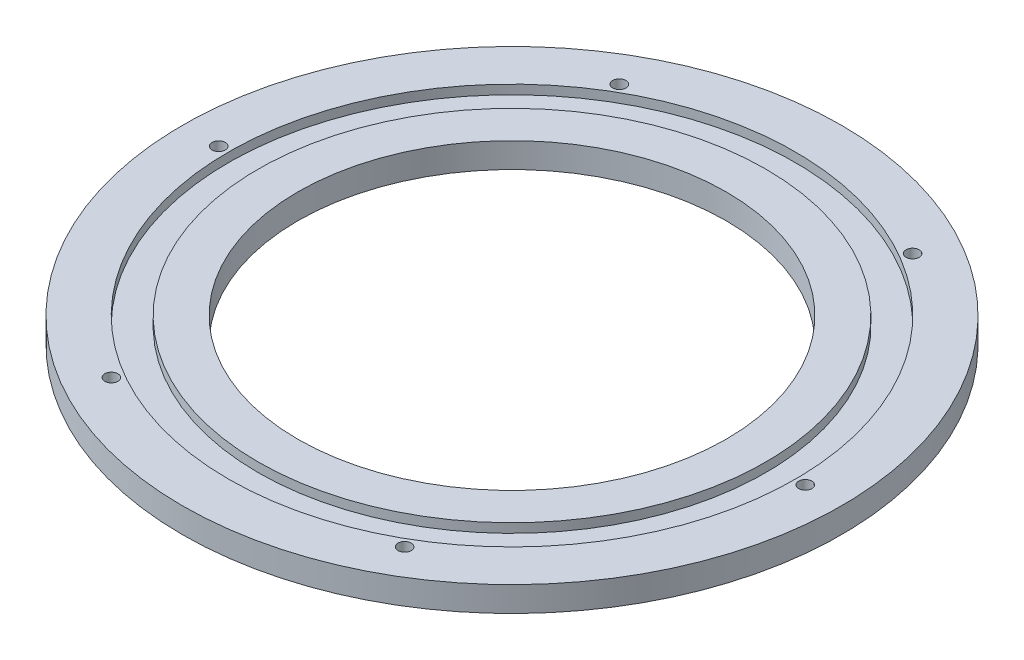
ISO-10303-21;
HEADER;
FILE_DESCRIPTION(('STEP AP214'),'2;1');
FILE_NAME('part.step','',(''),(''),'','','');
FILE_SCHEMA(('AUTOMOTIVE_DESIGN { 1 0 10303 214 1 1 1 1 }'));
ENDSEC;
DATA;
#1=APPLICATION_CONTEXT('core data for automotive mechanical design processes');
#2=APPLICATION_PROTOCOL_DEFINITION('international standard','automotive_design',2000,#1);
#3=PRODUCT_CONTEXT('',#1,'mechanical');
#4=PRODUCT('Part','Part','',(#3));
#5=PRODUCT_RELATED_PRODUCT_CATEGORY('part','',(#4));
#6=PRODUCT_DEFINITION_FORMATION('','',#4);
#7=PRODUCT_DEFINITION_CONTEXT('part definition',#1,'design');
#8=PRODUCT_DEFINITION('design','',#6,#7);
#9=PRODUCT_DEFINITION_SHAPE('','',#8);
#10=(LENGTH_UNIT() NAMED_UNIT(*) SI_UNIT(.MILLI.,.METRE.));
#11=(NAMED_UNIT(*) PLANE_ANGLE_UNIT() SI_UNIT($,.RADIAN.));
#12=(NAMED_UNIT(*) SI_UNIT($,.STERADIAN.) SOLID_ANGLE_UNIT());
#13=UNCERTAINTY_MEASURE_WITH_UNIT(LENGTH_MEASURE(1.E-05),#10,'distance_accuracy_value','');
#14=(GEOMETRIC_REPRESENTATION_CONTEXT(3) GLOBAL_UNCERTAINTY_ASSIGNED_CONTEXT((#13)) GLOBAL_UNIT_ASSIGNED_CONTEXT((#10,
#11,#12)) REPRESENTATION_CONTEXT('',''));
#15=CARTESIAN_POINT('',(0.,0.,0.));
#16=DIRECTION('',(0.,0.,1.));
#17=DIRECTION('',(1.,0.,0.));
#18=AXIS2_PLACEMENT_3D('',#15,#16,#17);
#19=CARTESIAN_POINT('',(0.,19.,0.));
#20=DIRECTION('',(0.,1.,0.));
#21=DIRECTION('',(0.,0.,1.));
#22=AXIS2_PLACEMENT_3D('',#19,#20,#21);
#23=PLANE('',#22);
#24=CARTESIAN_POINT('',(0.,19.,0.));
#25=DIRECTION('',(0.,1.,0.));
#26=DIRECTION('',(0.,0.,1.));
#27=AXIS2_PLACEMENT_3D('',#24,#25,#26);
#28=CIRCLE('',#27,162.5);
#29=CARTESIAN_POINT('',(0.,19.,162.5));
#30=VERTEX_POINT('',#29);
#31=EDGE_CURVE('E49',#30,#30,#28,.T.);
#32=ORIENTED_EDGE('',*,*,#31,.F.);
#33=EDGE_LOOP('',(#32));
#34=FACE_BOUND('',#33,.T.);
#35=CARTESIAN_POINT('',(0.,19.,0.));
#36=DIRECTION('',(0.,1.,0.));
#37=DIRECTION('',(0.,0.,1.));
#38=AXIS2_PLACEMENT_3D('',#35,#36,#37);
#39=CIRCLE('',#38,192.5);
#40=CARTESIAN_POINT('',(0.,19.,192.5));
#41=VERTEX_POINT('',#40);
#42=EDGE_CURVE('E67',#41,#41,#39,.T.);
#43=ORIENTED_EDGE('',*,*,#42,.T.);
#44=EDGE_LOOP('',(#43));
#45=FACE_BOUND('',#44,.T.);
#46=ADVANCED_FACE('F36',(#34,#45),#23,.T.);
#47=CARTESIAN_POINT('',(111.25,19.,-192.690652342037));
#48=DIRECTION('',(0.,-1.,0.));
#49=DIRECTION('',(0.,0.,1.));
#50=AXIS2_PLACEMENT_3D('',#47,#48,#49);
#51=CIRCLE('',#50,5.00000000000001);
#52=CARTESIAN_POINT('',(111.25,19.,-187.690652342037));
#53=VERTEX_POINT('',#52);
#54=EDGE_CURVE('E103',#53,#53,#51,.T.);
#55=ORIENTED_EDGE('',*,*,#54,.T.);
#56=EDGE_LOOP('',(#55));
#57=FACE_BOUND('',#56,.T.);
#58=CARTESIAN_POINT('',(-111.25,19.,192.690652342037));
#59=DIRECTION('',(0.,-1.,0.));
#60=DIRECTION('',(0.,0.,1.));
#61=AXIS2_PLACEMENT_3D('',#58,#59,#60);
#62=CIRCLE('',#61,5.00000000000001);
#63=CARTESIAN_POINT('',(-111.25,19.,197.690652342037));
#64=VERTEX_POINT('',#63);
#65=EDGE_CURVE('E88',#64,#64,#62,.T.);
#66=ORIENTED_EDGE('',*,*,#65,.T.);
#67=EDGE_LOOP('',(#66));
#68=FACE_BOUND('',#67,.T.);
#69=CARTESIAN_POINT('',(-222.5,19.,-1.55431223447522E-12));
#70=DIRECTION('',(0.,-1.,0.));
#71=DIRECTION('',(0.,0.,1.));
#72=AXIS2_PLACEMENT_3D('',#69,#70,#71);
#73=CIRCLE('',#72,4.99999999999992);
#74=CARTESIAN_POINT('',(-222.5,19.,4.99999999999837));
#75=VERTEX_POINT('',#74);
#76=EDGE_CURVE('E87',#75,#75,#73,.T.);
#77=ORIENTED_EDGE('',*,*,#76,.T.);
#78=EDGE_LOOP('',(#77));
#79=FACE_BOUND('',#78,.T.);
#80=CARTESIAN_POINT('',(222.5,19.,0.));
#81=DIRECTION('',(0.,-1.,0.));
#82=DIRECTION('',(0.,0.,-1.));
#83=AXIS2_PLACEMENT_3D('',#80,#81,#82);
#84=CIRCLE('',#83,4.99999999999999);
#85=CARTESIAN_POINT('',(222.5,19.,-4.99999999999999));
#86=VERTEX_POINT('',#85);
#87=EDGE_CURVE('E79',#86,#86,#84,.T.);
#88=ORIENTED_EDGE('',*,*,#87,.T.);
#89=EDGE_LOOP('',(#88));
#90=FACE_BOUND('',#89,.T.);
#91=CARTESIAN_POINT('',(-111.25,19.,-192.690652342037));
#92=DIRECTION('',(0.,-1.,0.));
#93=DIRECTION('',(0.,0.,-1.));
#94=AXIS2_PLACEMENT_3D('',#91,#92,#93);
#95=CIRCLE('',#94,5.00000000000001);
#96=CARTESIAN_POINT('',(-111.25,19.,-197.690652342037));
#97=VERTEX_POINT('',#96);
#98=EDGE_CURVE('E104',#97,#97,#95,.T.);
#99=ORIENTED_EDGE('',*,*,#98,.T.);
#100=EDGE_LOOP('',(#99));
#101=FACE_BOUND('',#100,.T.);
#102=CARTESIAN_POINT('',(111.25,19.,192.690652342037));
#103=DIRECTION('',(0.,-1.,0.));
#104=DIRECTION('',(0.,0.,-1.));
#105=AXIS2_PLACEMENT_3D('',#102,#103,#104);
#106=CIRCLE('',#105,5.00000000000001);
#107=CARTESIAN_POINT('',(111.25,19.,187.690652342037));
#108=VERTEX_POINT('',#107);
#109=EDGE_CURVE('E71',#108,#108,#106,.T.);
#110=ORIENTED_EDGE('',*,*,#109,.T.);
#111=EDGE_LOOP('',(#110));
#112=FACE_BOUND('',#111,.T.);
#113=CARTESIAN_POINT('',(0.,19.,0.));
#114=DIRECTION('',(0.,1.,0.));
#115=DIRECTION('',(0.,0.,1.));
#116=AXIS2_PLACEMENT_3D('',#113,#114,#115);
#117=CIRCLE('',#116,215.);
#118=CARTESIAN_POINT('',(0.,19.,215.));
#119=VERTEX_POINT('',#118);
#120=EDGE_CURVE('E59',#119,#119,#117,.T.);
#121=ORIENTED_EDGE('',*,*,#120,.F.);
#122=EDGE_LOOP('',(#121));
#123=FACE_BOUND('',#122,.T.);
#124=CARTESIAN_POINT('',(0.,19.,0.));
#125=DIRECTION('',(0.,1.,0.));
#126=DIRECTION('',(0.,0.,1.));
#127=AXIS2_PLACEMENT_3D('',#124,#125,#126);
#128=CIRCLE('',#127,250.);
#129=CARTESIAN_POINT('',(0.,19.,250.));
#130=VERTEX_POINT('',#129);
#131=EDGE_CURVE('E10',#130,#130,#128,.T.);
#132=ORIENTED_EDGE('',*,*,#131,.T.);
#133=EDGE_LOOP('',(#132));
#134=FACE_BOUND('',#133,.T.);
#135=ADVANCED_FACE('F123',(#57,#68,#79,#90,#101,#112,#123,#134),#23,.T.);
#136=CARTESIAN_POINT('',(0.,0.,0.));
#137=DIRECTION('',(0.,1.,0.));
#138=DIRECTION('',(0.,0.,1.));
#139=AXIS2_PLACEMENT_3D('',#136,#137,#138);
#140=PLANE('',#139);
#141=CARTESIAN_POINT('',(111.25,0.,-192.690652342037));
#142=DIRECTION('',(0.,-1.,0.));
#143=DIRECTION('',(0.,0.,1.));
#144=AXIS2_PLACEMENT_3D('',#141,#142,#143);
#145=CIRCLE('',#144,5.00000000000001);
#146=CARTESIAN_POINT('',(111.25,0.,-187.690652342037));
#147=VERTEX_POINT('',#146);
#148=EDGE_CURVE('E99',#147,#147,#145,.T.);
#149=ORIENTED_EDGE('',*,*,#148,.F.);
#150=EDGE_LOOP('',(#149));
#151=FACE_BOUND('',#150,.T.);
#152=CARTESIAN_POINT('',(-111.25,0.,192.690652342037));
#153=DIRECTION('',(0.,-1.,0.));
#154=DIRECTION('',(0.,0.,1.));
#155=AXIS2_PLACEMENT_3D('',#152,#153,#154);
#156=CIRCLE('',#155,5.00000000000001);
#157=CARTESIAN_POINT('',(-111.25,0.,197.690652342037));
#158=VERTEX_POINT('',#157);
#159=EDGE_CURVE('E108',#158,#158,#156,.T.);
#160=ORIENTED_EDGE('',*,*,#159,.F.);
#161=EDGE_LOOP('',(#160));
#162=FACE_BOUND('',#161,.T.);
#163=CARTESIAN_POINT('',(-222.5,0.,-1.55431223447522E-12));
#164=DIRECTION('',(0.,-1.,0.));
#165=DIRECTION('',(0.,0.,1.));
#166=AXIS2_PLACEMENT_3D('',#163,#164,#165);
#167=CIRCLE('',#166,4.99999999999992);
#168=CARTESIAN_POINT('',(-222.5,0.,4.99999999999837));
#169=VERTEX_POINT('',#168);
#170=EDGE_CURVE('E83',#169,#169,#167,.T.);
#171=ORIENTED_EDGE('',*,*,#170,.F.);
#172=EDGE_LOOP('',(#171));
#173=FACE_BOUND('',#172,.T.);
#174=CARTESIAN_POINT('',(222.5,0.,0.));
#175=DIRECTION('',(0.,-1.,0.));
#176=DIRECTION('',(0.,0.,-1.));
#177=AXIS2_PLACEMENT_3D('',#174,#175,#176);
#178=CIRCLE('',#177,4.99999999999999);
#179=CARTESIAN_POINT('',(222.5,0.,-4.99999999999999));
#180=VERTEX_POINT('',#179);
#181=EDGE_CURVE('E92',#180,#180,#178,.T.);
#182=ORIENTED_EDGE('',*,*,#181,.F.);
#183=EDGE_LOOP('',(#182));
#184=FACE_BOUND('',#183,.T.);
#185=CARTESIAN_POINT('',(-111.25,0.,-192.690652342037));
#186=DIRECTION('',(0.,-1.,0.));
#187=DIRECTION('',(0.,0.,-1.));
#188=AXIS2_PLACEMENT_3D('',#185,#186,#187);
#189=CIRCLE('',#188,5.00000000000001);
#190=CARTESIAN_POINT('',(-111.25,0.,-197.690652342037));
#191=VERTEX_POINT('',#190);
#192=EDGE_CURVE('E115',#191,#191,#189,.T.);
#193=ORIENTED_EDGE('',*,*,#192,.F.);
#194=EDGE_LOOP('',(#193));
#195=FACE_BOUND('',#194,.T.);
#196=CARTESIAN_POINT('',(111.25,0.,192.690652342037));
#197=DIRECTION('',(0.,-1.,0.));
#198=DIRECTION('',(0.,0.,-1.));
#199=AXIS2_PLACEMENT_3D('',#196,#197,#198);
#200=CIRCLE('',#199,5.00000000000001);
#201=CARTESIAN_POINT('',(111.25,0.,187.690652342037));
#202=VERTEX_POINT('',#201);
#203=EDGE_CURVE('E75',#202,#202,#200,.T.);
#204=ORIENTED_EDGE('',*,*,#203,.F.);
#205=EDGE_LOOP('',(#204));
#206=FACE_BOUND('',#205,.T.);
#207=CARTESIAN_POINT('',(0.,0.,0.));
#208=DIRECTION('',(0.,1.,0.));
#209=DIRECTION('',(0.,0.,1.));
#210=AXIS2_PLACEMENT_3D('',#207,#208,#209);
#211=CIRCLE('',#210,250.);
#212=CARTESIAN_POINT('',(0.,0.,250.));
#213=VERTEX_POINT('',#212);
#214=EDGE_CURVE('E40',#213,#213,#211,.T.);
#215=ORIENTED_EDGE('',*,*,#214,.F.);
#216=EDGE_LOOP('',(#215));
#217=FACE_BOUND('',#216,.T.);
#218=CARTESIAN_POINT('',(0.,0.,0.));
#219=DIRECTION('',(0.,1.,0.));
#220=DIRECTION('',(0.,0.,1.));
#221=AXIS2_PLACEMENT_3D('',#218,#219,#220);
#222=CIRCLE('',#221,162.5);
#223=CARTESIAN_POINT('',(0.,0.,162.5));
#224=VERTEX_POINT('',#223);
#225=EDGE_CURVE('E51',#224,#224,#222,.T.);
#226=ORIENTED_EDGE('',*,*,#225,.T.);
#227=EDGE_LOOP('',(#226));
#228=FACE_BOUND('',#227,.T.);
#229=ADVANCED_FACE('F134',(#151,#162,#173,#184,#195,#206,#217,#228),#140,.F.);
#230=CARTESIAN_POINT('',(0.,19.,0.));
#231=DIRECTION('',(0.,-1.,0.));
#232=DIRECTION('',(0.,0.,-1.));
#233=AXIS2_PLACEMENT_3D('',#230,#231,#232);
#234=CYLINDRICAL_SURFACE('',#233,250.);
#235=ORIENTED_EDGE('',*,*,#131,.F.);
#236=EDGE_LOOP('',(#235));
#237=FACE_BOUND('',#236,.T.);
#238=ORIENTED_EDGE('',*,*,#214,.T.);
#239=EDGE_LOOP('',(#238));
#240=FACE_BOUND('',#239,.T.);
#241=ADVANCED_FACE('F38',(#237,#240),#234,.T.);
#242=CARTESIAN_POINT('',(0.,19.,0.));
#243=DIRECTION('',(0.,-1.,0.));
#244=DIRECTION('',(0.,0.,-1.));
#245=AXIS2_PLACEMENT_3D('',#242,#243,#244);
#246=CYLINDRICAL_SURFACE('',#245,162.5);
#247=ORIENTED_EDGE('',*,*,#31,.T.);
#248=EDGE_LOOP('',(#247));
#249=FACE_BOUND('',#248,.T.);
#250=ORIENTED_EDGE('',*,*,#225,.F.);
#251=EDGE_LOOP('',(#250));
#252=FACE_BOUND('',#251,.T.);
#253=ADVANCED_FACE('F144',(#249,#252),#246,.F.);
#254=CARTESIAN_POINT('',(0.,12.,0.));
#255=DIRECTION('',(0.,1.,0.));
#256=DIRECTION('',(0.,0.,1.));
#257=AXIS2_PLACEMENT_3D('',#254,#255,#256);
#258=CYLINDRICAL_SURFACE('',#257,215.);
#259=CARTESIAN_POINT('',(0.,12.,0.));
#260=DIRECTION('',(0.,1.,0.));
#261=DIRECTION('',(0.,0.,1.));
#262=AXIS2_PLACEMENT_3D('',#259,#260,#261);
#263=CIRCLE('',#262,215.);
#264=CARTESIAN_POINT('',(0.,12.,215.));
#265=VERTEX_POINT('',#264);
#266=EDGE_CURVE('E55',#265,#265,#263,.T.);
#267=ORIENTED_EDGE('',*,*,#266,.F.);
#268=EDGE_LOOP('',(#267));
#269=FACE_BOUND('',#268,.T.);
#270=ORIENTED_EDGE('',*,*,#120,.T.);
#271=EDGE_LOOP('',(#270));
#272=FACE_BOUND('',#271,.T.);
#273=ADVANCED_FACE('F146',(#269,#272),#258,.F.);
#274=CARTESIAN_POINT('',(0.,12.,0.));
#275=DIRECTION('',(0.,1.,0.));
#276=DIRECTION('',(0.,0.,1.));
#277=AXIS2_PLACEMENT_3D('',#274,#275,#276);
#278=PLANE('',#277);
#279=CARTESIAN_POINT('',(0.,12.,0.));
#280=DIRECTION('',(0.,1.,0.));
#281=DIRECTION('',(0.,0.,1.));
#282=AXIS2_PLACEMENT_3D('',#279,#280,#281);
#283=CIRCLE('',#282,192.5);
#284=CARTESIAN_POINT('',(0.,12.,192.5));
#285=VERTEX_POINT('',#284);
#286=EDGE_CURVE('E63',#285,#285,#283,.T.);
#287=ORIENTED_EDGE('',*,*,#286,.F.);
#288=EDGE_LOOP('',(#287));
#289=FACE_BOUND('',#288,.T.);
#290=ORIENTED_EDGE('',*,*,#266,.T.);
#291=EDGE_LOOP('',(#290));
#292=FACE_BOUND('',#291,.T.);
#293=ADVANCED_FACE('F153',(#289,#292),#278,.T.);
#294=CARTESIAN_POINT('',(0.,12.,0.));
#295=DIRECTION('',(0.,1.,0.));
#296=DIRECTION('',(0.,0.,1.));
#297=AXIS2_PLACEMENT_3D('',#294,#295,#296);
#298=CYLINDRICAL_SURFACE('',#297,192.5);
#299=ORIENTED_EDGE('',*,*,#286,.T.);
#300=EDGE_LOOP('',(#299));
#301=FACE_BOUND('',#300,.T.);
#302=ORIENTED_EDGE('',*,*,#42,.F.);
#303=EDGE_LOOP('',(#302));
#304=FACE_BOUND('',#303,.T.);
#305=ADVANCED_FACE('F169',(#301,#304),#298,.T.);
#306=CARTESIAN_POINT('',(111.25,19.,192.690652342037));
#307=DIRECTION('',(0.,-1.,0.));
#308=DIRECTION('',(0.,0.,-1.));
#309=AXIS2_PLACEMENT_3D('',#306,#307,#308);
#310=CYLINDRICAL_SURFACE('',#309,5.00000000000001);
#311=ORIENTED_EDGE('',*,*,#109,.F.);
#312=EDGE_LOOP('',(#311));
#313=FACE_BOUND('',#312,.T.);
#314=ORIENTED_EDGE('',*,*,#203,.T.);
#315=EDGE_LOOP('',(#314));
#316=FACE_BOUND('',#315,.T.);
#317=ADVANCED_FACE('F130',(#313,#316),#310,.F.);
#318=CARTESIAN_POINT('',(-111.25,19.,-192.690652342037));
#319=DIRECTION('',(0.,-1.,0.));
#320=DIRECTION('',(0.,0.,-1.));
#321=AXIS2_PLACEMENT_3D('',#318,#319,#320);
#322=CYLINDRICAL_SURFACE('',#321,5.00000000000001);
#323=ORIENTED_EDGE('',*,*,#98,.F.);
#324=EDGE_LOOP('',(#323));
#325=FACE_BOUND('',#324,.T.);
#326=ORIENTED_EDGE('',*,*,#192,.T.);
#327=EDGE_LOOP('',(#326));
#328=FACE_BOUND('',#327,.T.);
#329=ADVANCED_FACE('F126',(#325,#328),#322,.F.);
#330=CARTESIAN_POINT('',(222.5,19.,0.));
#331=DIRECTION('',(0.,-1.,0.));
#332=DIRECTION('',(0.,0.,-1.));
#333=AXIS2_PLACEMENT_3D('',#330,#331,#332);
#334=CYLINDRICAL_SURFACE('',#333,4.99999999999999);
#335=ORIENTED_EDGE('',*,*,#87,.F.);
#336=EDGE_LOOP('',(#335));
#337=FACE_BOUND('',#336,.T.);
#338=ORIENTED_EDGE('',*,*,#181,.T.);
#339=EDGE_LOOP('',(#338));
#340=FACE_BOUND('',#339,.T.);
#341=ADVANCED_FACE('F129',(#337,#340),#334,.F.);
#342=CARTESIAN_POINT('',(-222.5,19.,-1.55431223447522E-12));
#343=DIRECTION('',(0.,-1.,0.));
#344=DIRECTION('',(0.,0.,-1.));
#345=AXIS2_PLACEMENT_3D('',#342,#343,#344);
#346=CYLINDRICAL_SURFACE('',#345,4.99999999999992);
#347=ORIENTED_EDGE('',*,*,#76,.F.);
#348=EDGE_LOOP('',(#347));
#349=FACE_BOUND('',#348,.T.);
#350=ORIENTED_EDGE('',*,*,#170,.T.);
#351=EDGE_LOOP('',(#350));
#352=FACE_BOUND('',#351,.T.);
#353=ADVANCED_FACE('F182',(#349,#352),#346,.F.);
#354=CARTESIAN_POINT('',(-111.25,19.,192.690652342037));
#355=DIRECTION('',(0.,-1.,0.));
#356=DIRECTION('',(0.,0.,-1.));
#357=AXIS2_PLACEMENT_3D('',#354,#355,#356);
#358=CYLINDRICAL_SURFACE('',#357,5.00000000000001);
#359=ORIENTED_EDGE('',*,*,#65,.F.);
#360=EDGE_LOOP('',(#359));
#361=FACE_BOUND('',#360,.T.);
#362=ORIENTED_EDGE('',*,*,#159,.T.);
#363=EDGE_LOOP('',(#362));
#364=FACE_BOUND('',#363,.T.);
#365=ADVANCED_FACE('F185',(#361,#364),#358,.F.);
#366=CARTESIAN_POINT('',(111.25,19.,-192.690652342037));
#367=DIRECTION('',(0.,-1.,0.));
#368=DIRECTION('',(0.,0.,-1.));
#369=AXIS2_PLACEMENT_3D('',#366,#367,#368);
#370=CYLINDRICAL_SURFACE('',#369,5.00000000000001);
#371=ORIENTED_EDGE('',*,*,#54,.F.);
#372=EDGE_LOOP('',(#371));
#373=FACE_BOUND('',#372,.T.);
#374=ORIENTED_EDGE('',*,*,#148,.T.);
#375=EDGE_LOOP('',(#374));
#376=FACE_BOUND('',#375,.T.);
#377=ADVANCED_FACE('F190',(#373,#376),#370,.F.);
#378=CLOSED_SHELL('',(#46,#135,#229,#241,#253,#273,#293,#305,#317,#329,#341,#353,#365,#377));
#379=MANIFOLD_SOLID_BREP('B2',#378);
#380=ADVANCED_BREP_SHAPE_REPRESENTATION('',(#18,#379),#14);
#381=SHAPE_DEFINITION_REPRESENTATION(#9,#380);
ENDSEC;
END-ISO-10303-21;
